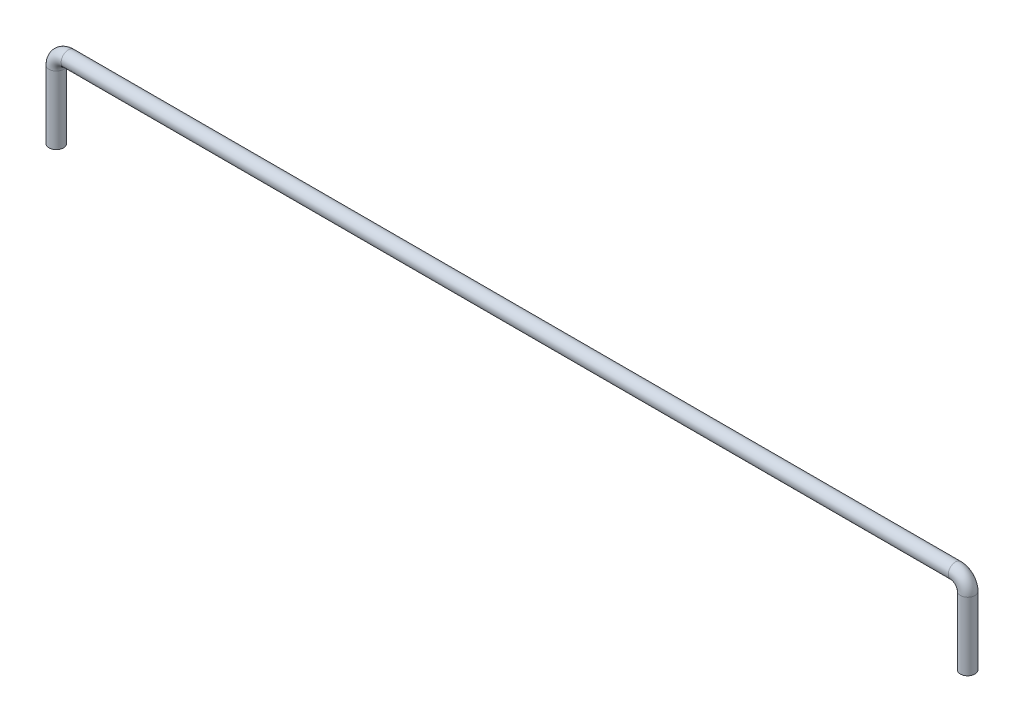
ISO-10303-21;
HEADER;
FILE_DESCRIPTION(('STEP AP214'),'2;1');
FILE_NAME('part.step','',(''),(''),'','','');
FILE_SCHEMA(('AUTOMOTIVE_DESIGN { 1 0 10303 214 1 1 1 1 }'));
ENDSEC;
DATA;
#1=APPLICATION_CONTEXT('core data for automotive mechanical design processes');
#2=APPLICATION_PROTOCOL_DEFINITION('international standard','automotive_design',2000,#1);
#3=PRODUCT_CONTEXT('',#1,'mechanical');
#4=PRODUCT('Part','Part','',(#3));
#5=PRODUCT_RELATED_PRODUCT_CATEGORY('part','',(#4));
#6=PRODUCT_DEFINITION_FORMATION('','',#4);
#7=PRODUCT_DEFINITION_CONTEXT('part definition',#1,'design');
#8=PRODUCT_DEFINITION('design','',#6,#7);
#9=PRODUCT_DEFINITION_SHAPE('','',#8);
#10=(LENGTH_UNIT() NAMED_UNIT(*) SI_UNIT(.MILLI.,.METRE.));
#11=(NAMED_UNIT(*) PLANE_ANGLE_UNIT() SI_UNIT($,.RADIAN.));
#12=(NAMED_UNIT(*) SI_UNIT($,.STERADIAN.) SOLID_ANGLE_UNIT());
#13=UNCERTAINTY_MEASURE_WITH_UNIT(LENGTH_MEASURE(1.E-05),#10,'distance_accuracy_value','');
#14=(GEOMETRIC_REPRESENTATION_CONTEXT(3) GLOBAL_UNCERTAINTY_ASSIGNED_CONTEXT((#13)) GLOBAL_UNIT_ASSIGNED_CONTEXT((#10,
#11,#12)) REPRESENTATION_CONTEXT('',''));
#15=CARTESIAN_POINT('',(0.,0.,0.));
#16=DIRECTION('',(0.,0.,1.));
#17=DIRECTION('',(1.,0.,0.));
#18=AXIS2_PLACEMENT_3D('',#15,#16,#17);
#19=CARTESIAN_POINT('',(0.,2.,0.));
#20=DIRECTION('',(0.,-1.,0.));
#21=DIRECTION('',(0.,0.,-1.));
#22=AXIS2_PLACEMENT_3D('',#19,#20,#21);
#23=CYLINDRICAL_SURFACE('',#22,0.3);
#24=CARTESIAN_POINT('',(0.,0.,0.));
#25=DIRECTION('',(0.,1.,0.));
#26=DIRECTION('',(0.,0.,1.));
#27=AXIS2_PLACEMENT_3D('',#24,#25,#26);
#28=CIRCLE('',#27,0.3);
#29=CARTESIAN_POINT('',(0.,0.,0.3));
#30=VERTEX_POINT('',#29);
#31=EDGE_CURVE('E10',#30,#30,#28,.T.);
#32=ORIENTED_EDGE('',*,*,#31,.T.);
#33=EDGE_LOOP('',(#32));
#34=FACE_BOUND('',#33,.T.);
#35=CARTESIAN_POINT('',(0.,2.8,0.));
#36=DIRECTION('',(0.,1.,0.));
#37=DIRECTION('',(0.,0.,1.));
#38=AXIS2_PLACEMENT_3D('',#35,#36,#37);
#39=CIRCLE('',#38,0.3);
#40=CARTESIAN_POINT('',(-0.3,2.8,0.));
#41=VERTEX_POINT('',#40);
#42=EDGE_CURVE('E67',#41,#41,#39,.T.);
#43=ORIENTED_EDGE('',*,*,#42,.F.);
#44=EDGE_LOOP('',(#43));
#45=FACE_BOUND('',#44,.T.);
#46=ADVANCED_FACE('F45',(#34,#45),#23,.T.);
#47=CARTESIAN_POINT('',(0.,0.,0.));
#48=DIRECTION('',(0.,1.,0.));
#49=DIRECTION('',(0.,0.,1.));
#50=AXIS2_PLACEMENT_3D('',#47,#48,#49);
#51=PLANE('',#50);
#52=ORIENTED_EDGE('',*,*,#31,.F.);
#53=EDGE_LOOP('',(#52));
#54=FACE_BOUND('',#53,.T.);
#55=ADVANCED_FACE('F74',(#54),#51,.F.);
#56=CARTESIAN_POINT('',(37.5,0.,0.));
#57=DIRECTION('',(0.,-1.,0.));
#58=DIRECTION('',(0.,0.,1.));
#59=AXIS2_PLACEMENT_3D('',#56,#57,#58);
#60=PLANE('',#59);
#61=CARTESIAN_POINT('',(37.5,0.,0.));
#62=DIRECTION('',(0.,-1.,0.));
#63=DIRECTION('',(0.,0.,1.));
#64=AXIS2_PLACEMENT_3D('',#61,#62,#63);
#65=CIRCLE('',#64,0.3);
#66=CARTESIAN_POINT('',(37.5,0.,0.3));
#67=VERTEX_POINT('',#66);
#68=EDGE_CURVE('E51',#67,#67,#65,.T.);
#69=ORIENTED_EDGE('',*,*,#68,.T.);
#70=EDGE_LOOP('',(#69));
#71=FACE_BOUND('',#70,.T.);
#72=ADVANCED_FACE('F79',(#71),#60,.T.);
#73=CARTESIAN_POINT('',(0.5,2.8,0.));
#74=DIRECTION('',(0.,0.,-1.));
#75=DIRECTION('',(-1.,0.,0.));
#76=AXIS2_PLACEMENT_3D('',#73,#74,#75);
#77=TOROIDAL_SURFACE('',#76,0.5,0.3);
#78=CARTESIAN_POINT('',(0.5,3.3,0.));
#79=DIRECTION('',(1.,0.,0.));
#80=DIRECTION('',(0.,0.,1.));
#81=AXIS2_PLACEMENT_3D('',#78,#79,#80);
#82=CIRCLE('',#81,0.3);
#83=CARTESIAN_POINT('',(0.5,3.6,0.));
#84=VERTEX_POINT('',#83);
#85=EDGE_CURVE('E64',#84,#84,#82,.T.);
#86=CARTESIAN_POINT('',(0.5,2.8,0.));
#87=DIRECTION('',(0.,0.,-1.));
#88=DIRECTION('',(-1.,0.,0.));
#89=AXIS2_PLACEMENT_3D('',#86,#87,#88);
#90=CIRCLE('',#89,0.8);
#91=EDGE_CURVE('',#41,#84,#90,.T.);
#92=ORIENTED_EDGE('',*,*,#42,.T.);
#93=ORIENTED_EDGE('',*,*,#85,.F.);
#94=ORIENTED_EDGE('',*,*,#91,.T.);
#95=ORIENTED_EDGE('',*,*,#91,.F.);
#96=EDGE_LOOP('',(#92,#94,#93,#95));
#97=FACE_BOUND('',#96,.T.);
#98=ADVANCED_FACE('F71',(#97),#77,.T.);
#99=CARTESIAN_POINT('',(0.5,3.3,0.));
#100=DIRECTION('',(1.,0.,0.));
#101=DIRECTION('',(0.,0.,-1.));
#102=AXIS2_PLACEMENT_3D('',#99,#100,#101);
#103=CYLINDRICAL_SURFACE('',#102,0.3);
#104=CARTESIAN_POINT('',(37.,3.3,0.));
#105=DIRECTION('',(1.,0.,0.));
#106=DIRECTION('',(0.,0.,1.));
#107=AXIS2_PLACEMENT_3D('',#104,#105,#106);
#108=CIRCLE('',#107,0.3);
#109=CARTESIAN_POINT('',(37.,3.6,0.));
#110=VERTEX_POINT('',#109);
#111=EDGE_CURVE('E59',#110,#110,#108,.T.);
#112=ORIENTED_EDGE('',*,*,#111,.F.);
#113=EDGE_LOOP('',(#112));
#114=FACE_BOUND('',#113,.T.);
#115=ORIENTED_EDGE('',*,*,#85,.T.);
#116=EDGE_LOOP('',(#115));
#117=FACE_BOUND('',#116,.T.);
#118=ADVANCED_FACE('F92',(#114,#117),#103,.T.);
#119=CARTESIAN_POINT('',(37.,2.8,0.));
#120=DIRECTION('',(0.,0.,-1.));
#121=DIRECTION('',(-1.,0.,0.));
#122=AXIS2_PLACEMENT_3D('',#119,#120,#121);
#123=TOROIDAL_SURFACE('',#122,0.5,0.3);
#124=CARTESIAN_POINT('',(37.5,2.8,0.));
#125=DIRECTION('',(0.,-1.,0.));
#126=DIRECTION('',(0.,0.,1.));
#127=AXIS2_PLACEMENT_3D('',#124,#125,#126);
#128=CIRCLE('',#127,0.3);
#129=CARTESIAN_POINT('',(37.8,2.8,0.));
#130=VERTEX_POINT('',#129);
#131=EDGE_CURVE('E55',#130,#130,#128,.T.);
#132=CARTESIAN_POINT('',(37.,2.8,0.));
#133=DIRECTION('',(0.,0.,-1.));
#134=DIRECTION('',(-1.,0.,0.));
#135=AXIS2_PLACEMENT_3D('',#132,#133,#134);
#136=CIRCLE('',#135,0.8);
#137=EDGE_CURVE('',#110,#130,#136,.T.);
#138=ORIENTED_EDGE('',*,*,#111,.T.);
#139=ORIENTED_EDGE('',*,*,#131,.F.);
#140=ORIENTED_EDGE('',*,*,#137,.T.);
#141=ORIENTED_EDGE('',*,*,#137,.F.);
#142=EDGE_LOOP('',(#138,#140,#139,#141));
#143=FACE_BOUND('',#142,.T.);
#144=ADVANCED_FACE('F86',(#143),#123,.T.);
#145=CARTESIAN_POINT('',(37.5,2.8,0.));
#146=DIRECTION('',(0.,-1.,0.));
#147=DIRECTION('',(0.,0.,-1.));
#148=AXIS2_PLACEMENT_3D('',#145,#146,#147);
#149=CYLINDRICAL_SURFACE('',#148,0.3);
#150=ORIENTED_EDGE('',*,*,#68,.F.);
#151=EDGE_LOOP('',(#150));
#152=FACE_BOUND('',#151,.T.);
#153=ORIENTED_EDGE('',*,*,#131,.T.);
#154=EDGE_LOOP('',(#153));
#155=FACE_BOUND('',#154,.T.);
#156=ADVANCED_FACE('F81',(#152,#155),#149,.T.);
#157=CLOSED_SHELL('',(#46,#55,#72,#98,#118,#144,#156));
#158=MANIFOLD_SOLID_BREP('B2',#157);
#159=ADVANCED_BREP_SHAPE_REPRESENTATION('',(#18,#158),#14);
#160=SHAPE_DEFINITION_REPRESENTATION(#9,#159);
ENDSEC;
END-ISO-10303-21;
